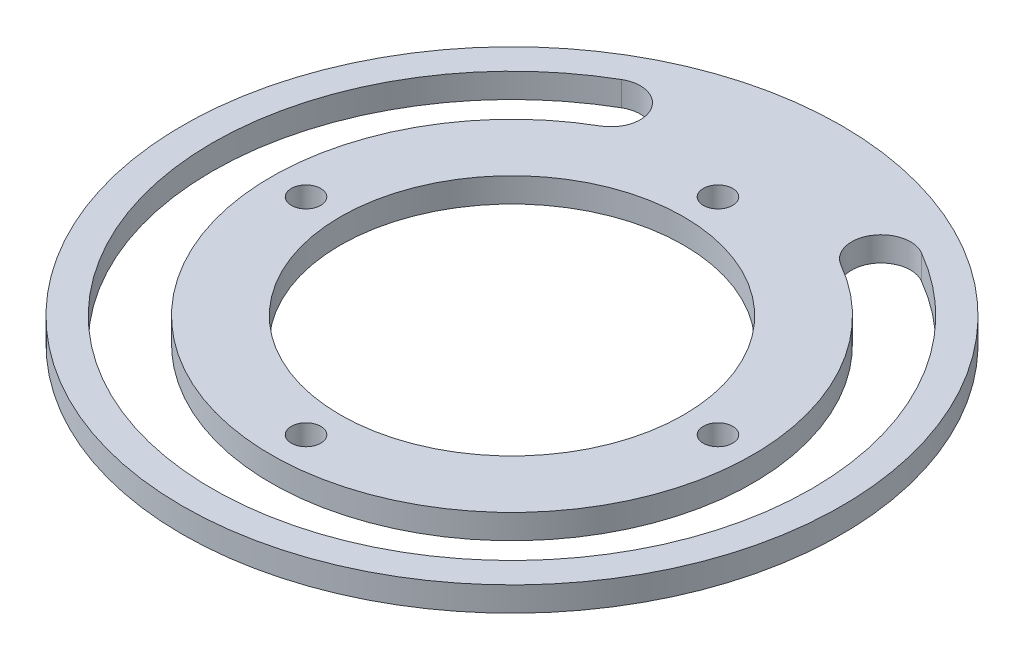
ISO-10303-21;
HEADER;
FILE_DESCRIPTION(('STEP AP214'),'2;1');
FILE_NAME('part.step','',(''),(''),'','','');
FILE_SCHEMA(('AUTOMOTIVE_DESIGN { 1 0 10303 214 1 1 1 1 }'));
ENDSEC;
DATA;
#1=APPLICATION_CONTEXT('core data for automotive mechanical design processes');
#2=APPLICATION_PROTOCOL_DEFINITION('international standard','automotive_design',2000,#1);
#3=PRODUCT_CONTEXT('',#1,'mechanical');
#4=PRODUCT('Part','Part','',(#3));
#5=PRODUCT_RELATED_PRODUCT_CATEGORY('part','',(#4));
#6=PRODUCT_DEFINITION_FORMATION('','',#4);
#7=PRODUCT_DEFINITION_CONTEXT('part definition',#1,'design');
#8=PRODUCT_DEFINITION('design','',#6,#7);
#9=PRODUCT_DEFINITION_SHAPE('','',#8);
#10=(LENGTH_UNIT() NAMED_UNIT(*) SI_UNIT(.MILLI.,.METRE.));
#11=(NAMED_UNIT(*) PLANE_ANGLE_UNIT() SI_UNIT($,.RADIAN.));
#12=(NAMED_UNIT(*) SI_UNIT($,.STERADIAN.) SOLID_ANGLE_UNIT());
#13=UNCERTAINTY_MEASURE_WITH_UNIT(LENGTH_MEASURE(1.E-05),#10,'distance_accuracy_value','');
#14=(GEOMETRIC_REPRESENTATION_CONTEXT(3) GLOBAL_UNCERTAINTY_ASSIGNED_CONTEXT((#13)) GLOBAL_UNIT_ASSIGNED_CONTEXT((#10,
#11,#12)) REPRESENTATION_CONTEXT('',''));
#15=CARTESIAN_POINT('',(0.,0.,0.));
#16=DIRECTION('',(0.,0.,1.));
#17=DIRECTION('',(1.,0.,0.));
#18=AXIS2_PLACEMENT_3D('',#15,#16,#17);
#19=CARTESIAN_POINT('',(0.,3.175,0.));
#20=DIRECTION('',(0.,1.,0.));
#21=DIRECTION('',(0.,0.,1.));
#22=AXIS2_PLACEMENT_3D('',#19,#20,#21);
#23=PLANE('',#22);
#24=CARTESIAN_POINT('',(0.,3.175,0.));
#25=DIRECTION('',(0.,1.,0.));
#26=DIRECTION('',(0.,0.,1.));
#27=AXIS2_PLACEMENT_3D('',#24,#25,#26);
#28=CIRCLE('',#27,38.7985);
#29=CARTESIAN_POINT('',(-19.39925,3.175,-33.6004866287305));
#30=VERTEX_POINT('',#29);
#31=CARTESIAN_POINT('',(19.39925,3.175,-33.6004866287305));
#32=VERTEX_POINT('',#31);
#33=EDGE_CURVE('E61',#30,#32,#28,.T.);
#34=ORIENTED_EDGE('',*,*,#33,.F.);
#35=CARTESIAN_POINT('',(-17.49425,3.175,-30.3009298403118));
#36=DIRECTION('',(0.,1.,0.));
#37=DIRECTION('',(0.,0.,1.));
#38=AXIS2_PLACEMENT_3D('',#35,#36,#37);
#39=CIRCLE('',#38,3.81);
#40=CARTESIAN_POINT('',(-15.58925,3.175,-27.0013730518931));
#41=VERTEX_POINT('',#40);
#42=EDGE_CURVE('E108',#41,#30,#39,.T.);
#43=ORIENTED_EDGE('',*,*,#42,.F.);
#44=CARTESIAN_POINT('',(0.,3.175,0.));
#45=DIRECTION('',(0.,-1.,0.));
#46=DIRECTION('',(0.,0.,1.));
#47=AXIS2_PLACEMENT_3D('',#44,#45,#46);
#48=CIRCLE('',#47,31.1785);
#49=CARTESIAN_POINT('',(15.58925,3.175,-27.0013730518931));
#50=VERTEX_POINT('',#49);
#51=EDGE_CURVE('E112',#50,#41,#48,.T.);
#52=ORIENTED_EDGE('',*,*,#51,.F.);
#53=CARTESIAN_POINT('',(17.49425,3.175,-30.3009298403118));
#54=DIRECTION('',(0.,1.,0.));
#55=DIRECTION('',(0.,0.,1.));
#56=AXIS2_PLACEMENT_3D('',#53,#54,#55);
#57=CIRCLE('',#56,3.81);
#58=EDGE_CURVE('E121',#32,#50,#57,.T.);
#59=ORIENTED_EDGE('',*,*,#58,.F.);
#60=EDGE_LOOP('',(#34,#43,#52,#59));
#61=FACE_BOUND('',#60,.T.);
#62=CARTESIAN_POINT('',(-1.86235614613893E-13,3.175,26.67));
#63=DIRECTION('',(0.,1.,0.));
#64=DIRECTION('',(0.,0.,1.));
#65=AXIS2_PLACEMENT_3D('',#62,#63,#64);
#66=CIRCLE('',#65,1.905);
#67=CARTESIAN_POINT('',(-1.86235614613893E-13,3.175,28.575));
#68=VERTEX_POINT('',#67);
#69=EDGE_CURVE('E144',#68,#68,#66,.T.);
#70=ORIENTED_EDGE('',*,*,#69,.F.);
#71=EDGE_LOOP('',(#70));
#72=FACE_BOUND('',#71,.T.);
#73=CARTESIAN_POINT('',(0.,3.175,-26.67));
#74=DIRECTION('',(0.,1.,0.));
#75=DIRECTION('',(0.,0.,1.));
#76=AXIS2_PLACEMENT_3D('',#73,#74,#75);
#77=CIRCLE('',#76,1.905);
#78=CARTESIAN_POINT('',(0.,3.175,-24.765));
#79=VERTEX_POINT('',#78);
#80=EDGE_CURVE('E160',#79,#79,#77,.T.);
#81=ORIENTED_EDGE('',*,*,#80,.F.);
#82=EDGE_LOOP('',(#81));
#83=FACE_BOUND('',#82,.T.);
#84=CARTESIAN_POINT('',(0.,3.175,0.));
#85=DIRECTION('',(0.,1.,0.));
#86=DIRECTION('',(0.,0.,1.));
#87=AXIS2_PLACEMENT_3D('',#84,#85,#86);
#88=CIRCLE('',#87,42.672);
#89=CARTESIAN_POINT('',(0.,3.175,42.672));
#90=VERTEX_POINT('',#89);
#91=EDGE_CURVE('E11',#90,#90,#88,.T.);
#92=ORIENTED_EDGE('',*,*,#91,.T.);
#93=EDGE_LOOP('',(#92));
#94=FACE_BOUND('',#93,.T.);
#95=CARTESIAN_POINT('',(0.,3.175,0.));
#96=DIRECTION('',(0.,1.,0.));
#97=DIRECTION('',(0.,0.,1.));
#98=AXIS2_PLACEMENT_3D('',#95,#96,#97);
#99=CIRCLE('',#98,22.225);
#100=CARTESIAN_POINT('',(0.,3.175,22.225));
#101=VERTEX_POINT('',#100);
#102=EDGE_CURVE('E168',#101,#101,#99,.T.);
#103=ORIENTED_EDGE('',*,*,#102,.F.);
#104=EDGE_LOOP('',(#103));
#105=FACE_BOUND('',#104,.T.);
#106=CARTESIAN_POINT('',(26.67,3.175,0.));
#107=DIRECTION('',(0.,1.,0.));
#108=DIRECTION('',(0.,0.,1.));
#109=AXIS2_PLACEMENT_3D('',#106,#107,#108);
#110=CIRCLE('',#109,1.905);
#111=CARTESIAN_POINT('',(26.67,3.175,1.90500000000009));
#112=VERTEX_POINT('',#111);
#113=EDGE_CURVE('E152',#112,#112,#110,.T.);
#114=ORIENTED_EDGE('',*,*,#113,.F.);
#115=EDGE_LOOP('',(#114));
#116=FACE_BOUND('',#115,.T.);
#117=CARTESIAN_POINT('',(-26.67,3.175,-2.79353421920839E-13));
#118=DIRECTION('',(0.,1.,0.));
#119=DIRECTION('',(0.,0.,1.));
#120=AXIS2_PLACEMENT_3D('',#117,#118,#119);
#121=CIRCLE('',#120,1.905);
#122=CARTESIAN_POINT('',(-26.67,3.175,1.90499999999972));
#123=VERTEX_POINT('',#122);
#124=EDGE_CURVE('E136',#123,#123,#121,.T.);
#125=ORIENTED_EDGE('',*,*,#124,.F.);
#126=EDGE_LOOP('',(#125));
#127=FACE_BOUND('',#126,.T.);
#128=ADVANCED_FACE('F45',(#61,#72,#83,#94,#105,#116,#127),#23,.T.);
#129=CARTESIAN_POINT('',(0.,0.,0.));
#130=DIRECTION('',(0.,1.,0.));
#131=DIRECTION('',(0.,0.,1.));
#132=AXIS2_PLACEMENT_3D('',#129,#130,#131);
#133=PLANE('',#132);
#134=CARTESIAN_POINT('',(-17.49425,0.,-30.3009298403118));
#135=DIRECTION('',(0.,1.,0.));
#136=DIRECTION('',(0.,0.,1.));
#137=AXIS2_PLACEMENT_3D('',#134,#135,#136);
#138=CIRCLE('',#137,3.81);
#139=CARTESIAN_POINT('',(-15.58925,0.,-27.0013730518931));
#140=VERTEX_POINT('',#139);
#141=CARTESIAN_POINT('',(-19.39925,0.,-33.6004866287305));
#142=VERTEX_POINT('',#141);
#143=EDGE_CURVE('E96',#140,#142,#138,.T.);
#144=ORIENTED_EDGE('',*,*,#143,.T.);
#145=CARTESIAN_POINT('',(0.,0.,0.));
#146=DIRECTION('',(0.,1.,0.));
#147=DIRECTION('',(0.,0.,1.));
#148=AXIS2_PLACEMENT_3D('',#145,#146,#147);
#149=CIRCLE('',#148,38.7985);
#150=CARTESIAN_POINT('',(19.39925,0.,-33.6004866287305));
#151=VERTEX_POINT('',#150);
#152=EDGE_CURVE('E89',#142,#151,#149,.T.);
#153=ORIENTED_EDGE('',*,*,#152,.T.);
#154=CARTESIAN_POINT('',(17.49425,0.,-30.3009298403118));
#155=DIRECTION('',(0.,1.,0.));
#156=DIRECTION('',(0.,0.,1.));
#157=AXIS2_PLACEMENT_3D('',#154,#155,#156);
#158=CIRCLE('',#157,3.81);
#159=CARTESIAN_POINT('',(15.58925,0.,-27.0013730518931));
#160=VERTEX_POINT('',#159);
#161=EDGE_CURVE('E99',#151,#160,#158,.T.);
#162=ORIENTED_EDGE('',*,*,#161,.T.);
#163=CARTESIAN_POINT('',(0.,0.,0.));
#164=DIRECTION('',(0.,-1.,0.));
#165=DIRECTION('',(0.,0.,1.));
#166=AXIS2_PLACEMENT_3D('',#163,#164,#165);
#167=CIRCLE('',#166,31.1785);
#168=EDGE_CURVE('E69',#160,#140,#167,.T.);
#169=ORIENTED_EDGE('',*,*,#168,.T.);
#170=EDGE_LOOP('',(#144,#153,#162,#169));
#171=FACE_BOUND('',#170,.T.);
#172=CARTESIAN_POINT('',(0.,0.,0.));
#173=DIRECTION('',(0.,1.,0.));
#174=DIRECTION('',(0.,0.,1.));
#175=AXIS2_PLACEMENT_3D('',#172,#173,#174);
#176=CIRCLE('',#175,42.672);
#177=CARTESIAN_POINT('',(0.,0.,42.672));
#178=VERTEX_POINT('',#177);
#179=EDGE_CURVE('E49',#178,#178,#176,.T.);
#180=ORIENTED_EDGE('',*,*,#179,.F.);
#181=EDGE_LOOP('',(#180));
#182=FACE_BOUND('',#181,.T.);
#183=CARTESIAN_POINT('',(0.,0.,0.));
#184=DIRECTION('',(0.,1.,0.));
#185=DIRECTION('',(0.,0.,1.));
#186=AXIS2_PLACEMENT_3D('',#183,#184,#185);
#187=CIRCLE('',#186,22.225);
#188=CARTESIAN_POINT('',(0.,0.,22.225));
#189=VERTEX_POINT('',#188);
#190=EDGE_CURVE('E164',#189,#189,#187,.T.);
#191=ORIENTED_EDGE('',*,*,#190,.T.);
#192=EDGE_LOOP('',(#191));
#193=FACE_BOUND('',#192,.T.);
#194=CARTESIAN_POINT('',(0.,0.,-26.67));
#195=DIRECTION('',(0.,1.,0.));
#196=DIRECTION('',(0.,0.,1.));
#197=AXIS2_PLACEMENT_3D('',#194,#195,#196);
#198=CIRCLE('',#197,1.905);
#199=CARTESIAN_POINT('',(0.,0.,-24.765));
#200=VERTEX_POINT('',#199);
#201=EDGE_CURVE('E156',#200,#200,#198,.T.);
#202=ORIENTED_EDGE('',*,*,#201,.T.);
#203=EDGE_LOOP('',(#202));
#204=FACE_BOUND('',#203,.T.);
#205=CARTESIAN_POINT('',(26.67,0.,0.));
#206=DIRECTION('',(0.,1.,0.));
#207=DIRECTION('',(0.,0.,1.));
#208=AXIS2_PLACEMENT_3D('',#205,#206,#207);
#209=CIRCLE('',#208,1.905);
#210=CARTESIAN_POINT('',(26.67,0.,1.90500000000009));
#211=VERTEX_POINT('',#210);
#212=EDGE_CURVE('E148',#211,#211,#209,.T.);
#213=ORIENTED_EDGE('',*,*,#212,.T.);
#214=EDGE_LOOP('',(#213));
#215=FACE_BOUND('',#214,.T.);
#216=CARTESIAN_POINT('',(-1.86235614613893E-13,0.,26.67));
#217=DIRECTION('',(0.,1.,0.));
#218=DIRECTION('',(0.,0.,1.));
#219=AXIS2_PLACEMENT_3D('',#216,#217,#218);
#220=CIRCLE('',#219,1.905);
#221=CARTESIAN_POINT('',(-1.86235614613893E-13,0.,28.575));
#222=VERTEX_POINT('',#221);
#223=EDGE_CURVE('E140',#222,#222,#220,.T.);
#224=ORIENTED_EDGE('',*,*,#223,.T.);
#225=EDGE_LOOP('',(#224));
#226=FACE_BOUND('',#225,.T.);
#227=CARTESIAN_POINT('',(-26.67,0.,-2.79353421920839E-13));
#228=DIRECTION('',(0.,1.,0.));
#229=DIRECTION('',(0.,0.,1.));
#230=AXIS2_PLACEMENT_3D('',#227,#228,#229);
#231=CIRCLE('',#230,1.905);
#232=CARTESIAN_POINT('',(-26.67,0.,1.90499999999972));
#233=VERTEX_POINT('',#232);
#234=EDGE_CURVE('E130',#233,#233,#231,.T.);
#235=ORIENTED_EDGE('',*,*,#234,.T.);
#236=EDGE_LOOP('',(#235));
#237=FACE_BOUND('',#236,.T.);
#238=ADVANCED_FACE('F104',(#171,#182,#193,#204,#215,#226,#237),#133,.F.);
#239=CARTESIAN_POINT('',(0.,3.175,0.));
#240=DIRECTION('',(0.,-1.,0.));
#241=DIRECTION('',(0.,0.,-1.));
#242=AXIS2_PLACEMENT_3D('',#239,#240,#241);
#243=CYLINDRICAL_SURFACE('',#242,42.672);
#244=ORIENTED_EDGE('',*,*,#91,.F.);
#245=EDGE_LOOP('',(#244));
#246=FACE_BOUND('',#245,.T.);
#247=ORIENTED_EDGE('',*,*,#179,.T.);
#248=EDGE_LOOP('',(#247));
#249=FACE_BOUND('',#248,.T.);
#250=ADVANCED_FACE('F47',(#246,#249),#243,.T.);
#251=CARTESIAN_POINT('',(0.,3.175,0.));
#252=DIRECTION('',(0.,-1.,0.));
#253=DIRECTION('',(0.,0.,-1.));
#254=AXIS2_PLACEMENT_3D('',#251,#252,#253);
#255=CYLINDRICAL_SURFACE('',#254,22.225);
#256=ORIENTED_EDGE('',*,*,#102,.T.);
#257=EDGE_LOOP('',(#256));
#258=FACE_BOUND('',#257,.T.);
#259=ORIENTED_EDGE('',*,*,#190,.F.);
#260=EDGE_LOOP('',(#259));
#261=FACE_BOUND('',#260,.T.);
#262=ADVANCED_FACE('F178',(#258,#261),#255,.F.);
#263=CARTESIAN_POINT('',(0.,3.175,-26.67));
#264=DIRECTION('',(0.,-1.,0.));
#265=DIRECTION('',(0.,0.,-1.));
#266=AXIS2_PLACEMENT_3D('',#263,#264,#265);
#267=CYLINDRICAL_SURFACE('',#266,1.905);
#268=ORIENTED_EDGE('',*,*,#80,.T.);
#269=EDGE_LOOP('',(#268));
#270=FACE_BOUND('',#269,.T.);
#271=ORIENTED_EDGE('',*,*,#201,.F.);
#272=EDGE_LOOP('',(#271));
#273=FACE_BOUND('',#272,.T.);
#274=ADVANCED_FACE('F180',(#270,#273),#267,.F.);
#275=CARTESIAN_POINT('',(26.67,3.175,0.));
#276=DIRECTION('',(0.,-1.,0.));
#277=DIRECTION('',(0.,0.,-1.));
#278=AXIS2_PLACEMENT_3D('',#275,#276,#277);
#279=CYLINDRICAL_SURFACE('',#278,1.905);
#280=ORIENTED_EDGE('',*,*,#113,.T.);
#281=EDGE_LOOP('',(#280));
#282=FACE_BOUND('',#281,.T.);
#283=ORIENTED_EDGE('',*,*,#212,.F.);
#284=EDGE_LOOP('',(#283));
#285=FACE_BOUND('',#284,.T.);
#286=ADVANCED_FACE('F187',(#282,#285),#279,.F.);
#287=CARTESIAN_POINT('',(-1.86235614613893E-13,3.175,26.67));
#288=DIRECTION('',(0.,-1.,0.));
#289=DIRECTION('',(0.,0.,-1.));
#290=AXIS2_PLACEMENT_3D('',#287,#288,#289);
#291=CYLINDRICAL_SURFACE('',#290,1.905);
#292=ORIENTED_EDGE('',*,*,#69,.T.);
#293=EDGE_LOOP('',(#292));
#294=FACE_BOUND('',#293,.T.);
#295=ORIENTED_EDGE('',*,*,#223,.F.);
#296=EDGE_LOOP('',(#295));
#297=FACE_BOUND('',#296,.T.);
#298=ADVANCED_FACE('F214',(#294,#297),#291,.F.);
#299=CARTESIAN_POINT('',(-26.67,3.175,-2.79353421920839E-13));
#300=DIRECTION('',(0.,-1.,0.));
#301=DIRECTION('',(0.,0.,-1.));
#302=AXIS2_PLACEMENT_3D('',#299,#300,#301);
#303=CYLINDRICAL_SURFACE('',#302,1.905);
#304=ORIENTED_EDGE('',*,*,#124,.T.);
#305=EDGE_LOOP('',(#304));
#306=FACE_BOUND('',#305,.T.);
#307=ORIENTED_EDGE('',*,*,#234,.F.);
#308=EDGE_LOOP('',(#307));
#309=FACE_BOUND('',#308,.T.);
#310=ADVANCED_FACE('F212',(#306,#309),#303,.F.);
#311=CARTESIAN_POINT('',(0.,0.,0.));
#312=DIRECTION('',(0.,1.,0.));
#313=DIRECTION('',(0.,0.,1.));
#314=AXIS2_PLACEMENT_3D('',#311,#312,#313);
#315=CYLINDRICAL_SURFACE('',#314,38.7985);
#316=ORIENTED_EDGE('',*,*,#33,.T.);
#317=DIRECTION('',(0.,1.,0.));
#318=VECTOR('',#317,1.);
#319=CARTESIAN_POINT('',(19.39925,0.,-33.6004866287305));
#320=LINE('',#319,#318);
#321=EDGE_CURVE('E85',#151,#32,#320,.T.);
#322=ORIENTED_EDGE('',*,*,#321,.F.);
#323=ORIENTED_EDGE('',*,*,#152,.F.);
#324=DIRECTION('',(0.,1.,0.));
#325=VECTOR('',#324,1.);
#326=CARTESIAN_POINT('',(-19.39925,0.,-33.6004866287305));
#327=LINE('',#326,#325);
#328=EDGE_CURVE('E127',#142,#30,#327,.T.);
#329=ORIENTED_EDGE('',*,*,#328,.T.);
#330=EDGE_LOOP('',(#316,#322,#323,#329));
#331=FACE_BOUND('',#330,.T.);
#332=ADVANCED_FACE('F87',(#331),#315,.F.);
#333=CARTESIAN_POINT('',(-17.49425,0.,-30.3009298403118));
#334=DIRECTION('',(0.,1.,0.));
#335=DIRECTION('',(0.,0.,1.));
#336=AXIS2_PLACEMENT_3D('',#333,#334,#335);
#337=CYLINDRICAL_SURFACE('',#336,3.81);
#338=ORIENTED_EDGE('',*,*,#42,.T.);
#339=ORIENTED_EDGE('',*,*,#328,.F.);
#340=ORIENTED_EDGE('',*,*,#143,.F.);
#341=DIRECTION('',(0.,1.,0.));
#342=VECTOR('',#341,1.);
#343=CARTESIAN_POINT('',(-15.58925,0.,-27.0013730518931));
#344=LINE('',#343,#342);
#345=EDGE_CURVE('E131',#140,#41,#344,.T.);
#346=ORIENTED_EDGE('',*,*,#345,.T.);
#347=EDGE_LOOP('',(#338,#339,#340,#346));
#348=FACE_BOUND('',#347,.T.);
#349=ADVANCED_FACE('F222',(#348),#337,.F.);
#350=CARTESIAN_POINT('',(0.,0.,0.));
#351=DIRECTION('',(0.,1.,0.));
#352=DIRECTION('',(0.,0.,1.));
#353=AXIS2_PLACEMENT_3D('',#350,#351,#352);
#354=CYLINDRICAL_SURFACE('',#353,31.1785);
#355=ORIENTED_EDGE('',*,*,#51,.T.);
#356=ORIENTED_EDGE('',*,*,#345,.F.);
#357=ORIENTED_EDGE('',*,*,#168,.F.);
#358=DIRECTION('',(0.,1.,0.));
#359=VECTOR('',#358,1.);
#360=CARTESIAN_POINT('',(15.58925,0.,-27.0013730518931));
#361=LINE('',#360,#359);
#362=EDGE_CURVE('E95',#160,#50,#361,.T.);
#363=ORIENTED_EDGE('',*,*,#362,.T.);
#364=EDGE_LOOP('',(#355,#356,#357,#363));
#365=FACE_BOUND('',#364,.T.);
#366=ADVANCED_FACE('F265',(#365),#354,.T.);
#367=CARTESIAN_POINT('',(17.49425,0.,-30.3009298403118));
#368=DIRECTION('',(0.,1.,0.));
#369=DIRECTION('',(0.,0.,1.));
#370=AXIS2_PLACEMENT_3D('',#367,#368,#369);
#371=CYLINDRICAL_SURFACE('',#370,3.81);
#372=ORIENTED_EDGE('',*,*,#58,.T.);
#373=ORIENTED_EDGE('',*,*,#362,.F.);
#374=ORIENTED_EDGE('',*,*,#161,.F.);
#375=ORIENTED_EDGE('',*,*,#321,.T.);
#376=EDGE_LOOP('',(#372,#373,#374,#375));
#377=FACE_BOUND('',#376,.T.);
#378=ADVANCED_FACE('F100',(#377),#371,.F.);
#379=CLOSED_SHELL('',(#128,#238,#250,#262,#274,#286,#298,#310,#332,#349,#366,#378));
#380=MANIFOLD_SOLID_BREP('B2',#379);
#381=ADVANCED_BREP_SHAPE_REPRESENTATION('',(#18,#380),#14);
#382=SHAPE_DEFINITION_REPRESENTATION(#9,#381);
ENDSEC;
END-ISO-10303-21;
